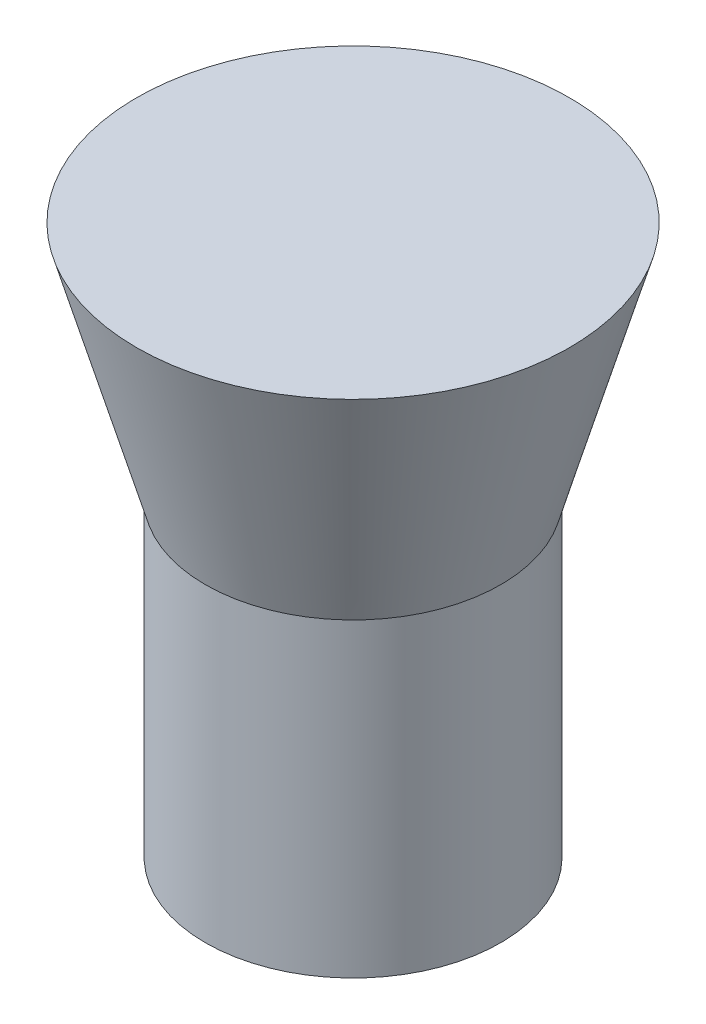
ISO-10303-21;
HEADER;
FILE_DESCRIPTION(('STEP AP214'),'2;1');
FILE_NAME('part.step','',(''),(''),'','','');
FILE_SCHEMA(('AUTOMOTIVE_DESIGN { 1 0 10303 214 1 1 1 1 }'));
ENDSEC;
DATA;
#1=APPLICATION_CONTEXT('core data for automotive mechanical design processes');
#2=APPLICATION_PROTOCOL_DEFINITION('international standard','automotive_design',2000,#1);
#3=PRODUCT_CONTEXT('',#1,'mechanical');
#4=PRODUCT('Part','Part','',(#3));
#5=PRODUCT_RELATED_PRODUCT_CATEGORY('part','',(#4));
#6=PRODUCT_DEFINITION_FORMATION('','',#4);
#7=PRODUCT_DEFINITION_CONTEXT('part definition',#1,'design');
#8=PRODUCT_DEFINITION('design','',#6,#7);
#9=PRODUCT_DEFINITION_SHAPE('','',#8);
#10=(LENGTH_UNIT() NAMED_UNIT(*) SI_UNIT(.MILLI.,.METRE.));
#11=(NAMED_UNIT(*) PLANE_ANGLE_UNIT() SI_UNIT($,.RADIAN.));
#12=(NAMED_UNIT(*) SI_UNIT($,.STERADIAN.) SOLID_ANGLE_UNIT());
#13=UNCERTAINTY_MEASURE_WITH_UNIT(LENGTH_MEASURE(1.E-05),#10,'distance_accuracy_value','');
#14=(GEOMETRIC_REPRESENTATION_CONTEXT(3) GLOBAL_UNCERTAINTY_ASSIGNED_CONTEXT((#13)) GLOBAL_UNIT_ASSIGNED_CONTEXT((#10,
#11,#12)) REPRESENTATION_CONTEXT('',''));
#15=CARTESIAN_POINT('',(0.,0.,0.));
#16=DIRECTION('',(0.,0.,1.));
#17=DIRECTION('',(1.,0.,0.));
#18=AXIS2_PLACEMENT_3D('',#15,#16,#17);
#19=CARTESIAN_POINT('',(0.,8.,0.));
#20=DIRECTION('',(0.,-1.,0.));
#21=DIRECTION('',(0.,0.,-1.));
#22=AXIS2_PLACEMENT_3D('',#19,#20,#21);
#23=CYLINDRICAL_SURFACE('',#22,2.15);
#24=CARTESIAN_POINT('',(0.,4.51258555615909,0.));
#25=DIRECTION('',(0.,1.,0.));
#26=DIRECTION('',(0.,0.,1.));
#27=AXIS2_PLACEMENT_3D('',#24,#25,#26);
#28=CIRCLE('',#27,2.15);
#29=CARTESIAN_POINT('',(0.,4.51258555615909,2.15));
#30=VERTEX_POINT('',#29);
#31=EDGE_CURVE('E46',#30,#30,#28,.F.);
#32=ORIENTED_EDGE('',*,*,#31,.T.);
#33=EDGE_LOOP('',(#32));
#34=FACE_BOUND('',#33,.T.);
#35=CARTESIAN_POINT('',(0.,0.,0.));
#36=DIRECTION('',(0.,1.,0.));
#37=DIRECTION('',(0.,0.,1.));
#38=AXIS2_PLACEMENT_3D('',#35,#36,#37);
#39=CIRCLE('',#38,2.15);
#40=CARTESIAN_POINT('',(0.,0.,2.15));
#41=VERTEX_POINT('',#40);
#42=EDGE_CURVE('E10',#41,#41,#39,.T.);
#43=ORIENTED_EDGE('',*,*,#42,.T.);
#44=EDGE_LOOP('',(#43));
#45=FACE_BOUND('',#44,.T.);
#46=ADVANCED_FACE('F43',(#34,#45),#23,.T.);
#47=CARTESIAN_POINT('',(0.,0.,0.));
#48=DIRECTION('',(0.,1.,0.));
#49=DIRECTION('',(0.,0.,1.));
#50=AXIS2_PLACEMENT_3D('',#47,#48,#49);
#51=PLANE('',#50);
#52=ORIENTED_EDGE('',*,*,#42,.F.);
#53=EDGE_LOOP('',(#52));
#54=FACE_BOUND('',#53,.T.);
#55=ADVANCED_FACE('F66',(#54),#51,.F.);
#56=CARTESIAN_POINT('',(0.,8.,0.));
#57=DIRECTION('',(0.,1.,0.));
#58=DIRECTION('',(0.,0.,1.));
#59=AXIS2_PLACEMENT_3D('',#56,#57,#58);
#60=CONICAL_SURFACE('',#59,3.15,0.279252680319093);
#61=CARTESIAN_POINT('',(0.,8.,0.));
#62=DIRECTION('',(0.,1.,0.));
#63=DIRECTION('',(0.,0.,1.));
#64=AXIS2_PLACEMENT_3D('',#61,#62,#63);
#65=CIRCLE('',#64,3.15);
#66=CARTESIAN_POINT('',(0.,8.,3.15));
#67=VERTEX_POINT('',#66);
#68=EDGE_CURVE('E55',#67,#67,#65,.T.);
#69=ORIENTED_EDGE('',*,*,#68,.F.);
#70=EDGE_LOOP('',(#69));
#71=FACE_BOUND('',#70,.T.);
#72=ORIENTED_EDGE('',*,*,#31,.F.);
#73=EDGE_LOOP('',(#72));
#74=FACE_BOUND('',#73,.T.);
#75=ADVANCED_FACE('F63',(#71,#74),#60,.T.);
#76=CARTESIAN_POINT('',(0.,8.,0.));
#77=DIRECTION('',(0.,1.,0.));
#78=DIRECTION('',(0.,0.,1.));
#79=AXIS2_PLACEMENT_3D('',#76,#77,#78);
#80=PLANE('',#79);
#81=ORIENTED_EDGE('',*,*,#68,.T.);
#82=EDGE_LOOP('',(#81));
#83=FACE_BOUND('',#82,.T.);
#84=ADVANCED_FACE('F61',(#83),#80,.T.);
#85=CLOSED_SHELL('',(#46,#55,#75,#84));
#86=MANIFOLD_SOLID_BREP('B2',#85);
#87=ADVANCED_BREP_SHAPE_REPRESENTATION('',(#18,#86),#14);
#88=SHAPE_DEFINITION_REPRESENTATION(#9,#87);
ENDSEC;
END-ISO-10303-21;
